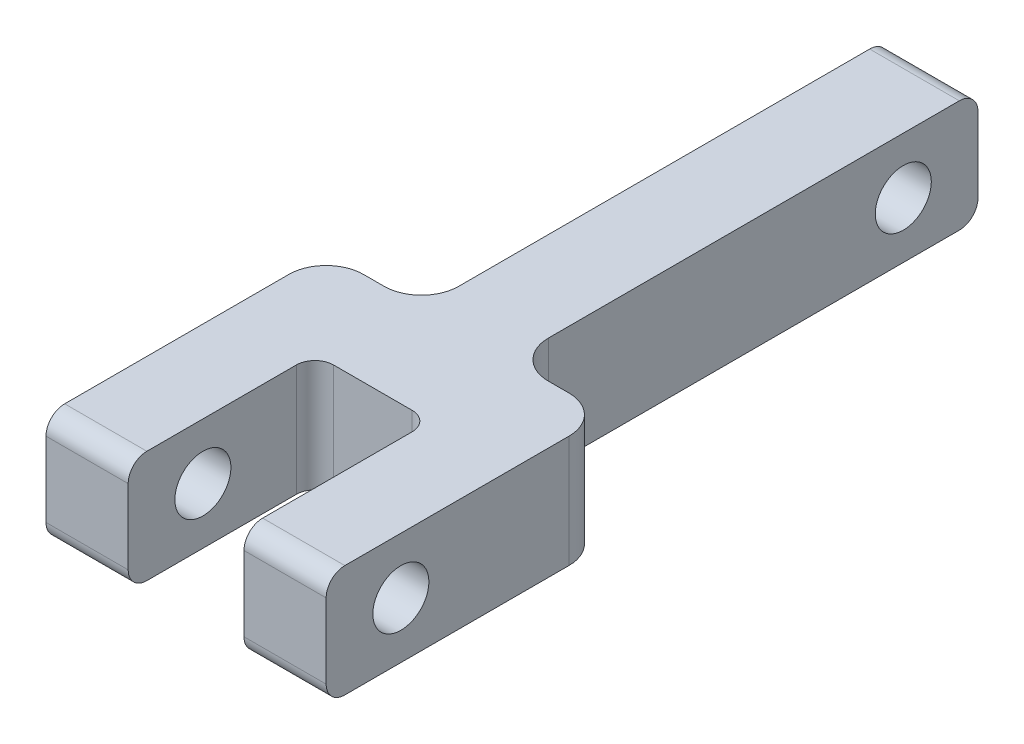
ISO-10303-21;
HEADER;
FILE_DESCRIPTION(('STEP AP214'),'2;1');
FILE_NAME('part.step','',(''),(''),'','','');
FILE_SCHEMA(('AUTOMOTIVE_DESIGN { 1 0 10303 214 1 1 1 1 }'));
ENDSEC;
DATA;
#1=APPLICATION_CONTEXT('core data for automotive mechanical design processes');
#2=APPLICATION_PROTOCOL_DEFINITION('international standard','automotive_design',2000,#1);
#3=PRODUCT_CONTEXT('',#1,'mechanical');
#4=PRODUCT('Part','Part','',(#3));
#5=PRODUCT_RELATED_PRODUCT_CATEGORY('part','',(#4));
#6=PRODUCT_DEFINITION_FORMATION('','',#4);
#7=PRODUCT_DEFINITION_CONTEXT('part definition',#1,'design');
#8=PRODUCT_DEFINITION('design','',#6,#7);
#9=PRODUCT_DEFINITION_SHAPE('','',#8);
#10=(LENGTH_UNIT() NAMED_UNIT(*) SI_UNIT(.MILLI.,.METRE.));
#11=(NAMED_UNIT(*) PLANE_ANGLE_UNIT() SI_UNIT($,.RADIAN.));
#12=(NAMED_UNIT(*) SI_UNIT($,.STERADIAN.) SOLID_ANGLE_UNIT());
#13=UNCERTAINTY_MEASURE_WITH_UNIT(LENGTH_MEASURE(1.E-05),#10,'distance_accuracy_value','');
#14=(GEOMETRIC_REPRESENTATION_CONTEXT(3) GLOBAL_UNCERTAINTY_ASSIGNED_CONTEXT((#13)) GLOBAL_UNIT_ASSIGNED_CONTEXT((#10,
#11,#12)) REPRESENTATION_CONTEXT('',''));
#15=CARTESIAN_POINT('',(0.,0.,0.));
#16=DIRECTION('',(0.,0.,1.));
#17=DIRECTION('',(1.,0.,0.));
#18=AXIS2_PLACEMENT_3D('',#15,#16,#17);
#19=CARTESIAN_POINT('',(2.4,-2.,19.));
#20=DIRECTION('',(-1.,0.,0.));
#21=DIRECTION('',(0.,0.,1.));
#22=AXIS2_PLACEMENT_3D('',#19,#20,#21);
#23=CYLINDRICAL_SURFACE('',#22,1.);
#24=CARTESIAN_POINT('',(-3.1,-2.,19.));
#25=DIRECTION('',(1.,0.,0.));
#26=DIRECTION('',(0.,0.,-1.));
#27=AXIS2_PLACEMENT_3D('',#24,#25,#26);
#28=CIRCLE('',#27,1.);
#29=CARTESIAN_POINT('',(-3.1,-2.,20.));
#30=VERTEX_POINT('',#29);
#31=CARTESIAN_POINT('',(-3.1,-3.,19.));
#32=VERTEX_POINT('',#31);
#33=EDGE_CURVE('E214',#30,#32,#28,.T.);
#34=ORIENTED_EDGE('',*,*,#33,.F.);
#35=DIRECTION('',(-1.,0.,0.));
#36=VECTOR('',#35,1.);
#37=CARTESIAN_POINT('',(2.4,-2.,20.));
#38=LINE('',#37,#36);
#39=CARTESIAN_POINT('',(-7.5,-2.,20.));
#40=VERTEX_POINT('',#39);
#41=EDGE_CURVE('E213',#30,#40,#38,.T.);
#42=ORIENTED_EDGE('',*,*,#41,.T.);
#43=CARTESIAN_POINT('',(-7.5,-2.,19.));
#44=DIRECTION('',(1.,0.,0.));
#45=DIRECTION('',(0.,0.,-1.));
#46=AXIS2_PLACEMENT_3D('',#43,#44,#45);
#47=CIRCLE('',#46,1.);
#48=CARTESIAN_POINT('',(-7.5,-3.,19.));
#49=VERTEX_POINT('',#48);
#50=EDGE_CURVE('E359',#40,#49,#47,.T.);
#51=ORIENTED_EDGE('',*,*,#50,.T.);
#52=DIRECTION('',(-1.,0.,0.));
#53=VECTOR('',#52,1.);
#54=CARTESIAN_POINT('',(2.4,-3.,19.));
#55=LINE('',#54,#53);
#56=EDGE_CURVE('E244',#32,#49,#55,.T.);
#57=ORIENTED_EDGE('',*,*,#56,.F.);
#58=EDGE_LOOP('',(#34,#42,#51,#57));
#59=FACE_BOUND('',#58,.T.);
#60=ADVANCED_FACE('F33',(#59),#23,.T.);
#61=CARTESIAN_POINT('',(2.4,-3.,19.));
#62=DIRECTION('',(0.,1.,0.));
#63=DIRECTION('',(0.,0.,1.));
#64=AXIS2_PLACEMENT_3D('',#61,#62,#63);
#65=PLANE('',#64);
#66=DIRECTION('',(-1.,0.,0.));
#67=VECTOR('',#66,1.);
#68=CARTESIAN_POINT('',(7.5,-3.,5.));
#69=LINE('',#68,#67);
#70=CARTESIAN_POINT('',(5.5,-3.,5.));
#71=VERTEX_POINT('',#70);
#72=CARTESIAN_POINT('',(4.4,-3.,5.));
#73=VERTEX_POINT('',#72);
#74=EDGE_CURVE('E372',#71,#73,#69,.T.);
#75=ORIENTED_EDGE('',*,*,#74,.F.);
#76=CARTESIAN_POINT('',(5.5,-3.,7.));
#77=DIRECTION('',(0.,1.,0.));
#78=DIRECTION('',(0.,0.,1.));
#79=AXIS2_PLACEMENT_3D('',#76,#77,#78);
#80=CIRCLE('',#79,2.);
#81=CARTESIAN_POINT('',(7.5,-3.,7.));
#82=VERTEX_POINT('',#81);
#83=EDGE_CURVE('E269',#71,#82,#80,.F.);
#84=ORIENTED_EDGE('',*,*,#83,.T.);
#85=DIRECTION('',(0.,0.,-1.));
#86=VECTOR('',#85,1.);
#87=CARTESIAN_POINT('',(7.5,-3.,5.));
#88=LINE('',#87,#86);
#89=CARTESIAN_POINT('',(7.5,-3.,19.));
#90=VERTEX_POINT('',#89);
#91=EDGE_CURVE('E350',#90,#82,#88,.T.);
#92=ORIENTED_EDGE('',*,*,#91,.F.);
#93=CARTESIAN_POINT('',(3.1,-3.,19.));
#94=VERTEX_POINT('',#93);
#95=EDGE_CURVE('E245',#90,#94,#55,.T.);
#96=ORIENTED_EDGE('',*,*,#95,.T.);
#97=DIRECTION('',(0.,0.,-1.));
#98=VECTOR('',#97,1.);
#99=CARTESIAN_POINT('',(3.1,-3.,10.));
#100=LINE('',#99,#98);
#101=CARTESIAN_POINT('',(3.1,-3.,11.));
#102=VERTEX_POINT('',#101);
#103=EDGE_CURVE('E330',#94,#102,#100,.T.);
#104=ORIENTED_EDGE('',*,*,#103,.T.);
#105=CARTESIAN_POINT('',(2.1,-3.,11.));
#106=DIRECTION('',(0.,1.,0.));
#107=DIRECTION('',(0.,0.,1.));
#108=AXIS2_PLACEMENT_3D('',#105,#106,#107);
#109=CIRCLE('',#108,1.);
#110=CARTESIAN_POINT('',(2.1,-3.,10.));
#111=VERTEX_POINT('',#110);
#112=EDGE_CURVE('E303',#102,#111,#109,.T.);
#113=ORIENTED_EDGE('',*,*,#112,.T.);
#114=DIRECTION('',(1.,0.,0.));
#115=VECTOR('',#114,1.);
#116=CARTESIAN_POINT('',(-3.1,-3.,10.));
#117=LINE('',#116,#115);
#118=CARTESIAN_POINT('',(-2.1,-3.,10.));
#119=VERTEX_POINT('',#118);
#120=EDGE_CURVE('E313',#119,#111,#117,.T.);
#121=ORIENTED_EDGE('',*,*,#120,.F.);
#122=CARTESIAN_POINT('',(-2.1,-3.,11.));
#123=DIRECTION('',(0.,1.,0.));
#124=DIRECTION('',(0.,0.,1.));
#125=AXIS2_PLACEMENT_3D('',#122,#123,#124);
#126=CIRCLE('',#125,1.);
#127=CARTESIAN_POINT('',(-3.1,-3.,11.));
#128=VERTEX_POINT('',#127);
#129=EDGE_CURVE('E11',#119,#128,#126,.T.);
#130=ORIENTED_EDGE('',*,*,#129,.T.);
#131=DIRECTION('',(0.,0.,-1.));
#132=VECTOR('',#131,1.);
#133=CARTESIAN_POINT('',(-3.1,-3.,10.));
#134=LINE('',#133,#132);
#135=EDGE_CURVE('E315',#32,#128,#134,.T.);
#136=ORIENTED_EDGE('',*,*,#135,.F.);
#137=ORIENTED_EDGE('',*,*,#56,.T.);
#138=DIRECTION('',(0.,0.,-1.));
#139=VECTOR('',#138,1.);
#140=CARTESIAN_POINT('',(-7.5,-3.,5.));
#141=LINE('',#140,#139);
#142=CARTESIAN_POINT('',(-7.5,-3.,7.));
#143=VERTEX_POINT('',#142);
#144=EDGE_CURVE('E362',#49,#143,#141,.T.);
#145=ORIENTED_EDGE('',*,*,#144,.T.);
#146=CARTESIAN_POINT('',(-5.5,-3.,7.));
#147=DIRECTION('',(0.,1.,0.));
#148=DIRECTION('',(0.,0.,1.));
#149=AXIS2_PLACEMENT_3D('',#146,#147,#148);
#150=CIRCLE('',#149,2.);
#151=CARTESIAN_POINT('',(-5.5,-3.,5.));
#152=VERTEX_POINT('',#151);
#153=EDGE_CURVE('E267',#143,#152,#150,.F.);
#154=ORIENTED_EDGE('',*,*,#153,.T.);
#155=CARTESIAN_POINT('',(-4.4,-3.,5.));
#156=VERTEX_POINT('',#155);
#157=EDGE_CURVE('E369',#156,#152,#69,.T.);
#158=ORIENTED_EDGE('',*,*,#157,.F.);
#159=CARTESIAN_POINT('',(-4.4,-3.,3.));
#160=DIRECTION('',(0.,1.,0.));
#161=DIRECTION('',(0.,0.,1.));
#162=AXIS2_PLACEMENT_3D('',#159,#160,#161);
#163=CIRCLE('',#162,2.);
#164=CARTESIAN_POINT('',(-2.4,-3.,3.));
#165=VERTEX_POINT('',#164);
#166=EDGE_CURVE('E288',#156,#165,#163,.T.);
#167=ORIENTED_EDGE('',*,*,#166,.T.);
#168=DIRECTION('',(0.,0.,-1.));
#169=VECTOR('',#168,1.);
#170=CARTESIAN_POINT('',(-2.4,-3.,19.));
#171=LINE('',#170,#169);
#172=CARTESIAN_POINT('',(-2.4,-3.,-19.));
#173=VERTEX_POINT('',#172);
#174=EDGE_CURVE('E379',#165,#173,#171,.T.);
#175=ORIENTED_EDGE('',*,*,#174,.T.);
#176=DIRECTION('',(-1.,0.,0.));
#177=VECTOR('',#176,1.);
#178=CARTESIAN_POINT('',(2.4,-3.,-19.));
#179=LINE('',#178,#177);
#180=CARTESIAN_POINT('',(2.4,-3.,-19.));
#181=VERTEX_POINT('',#180);
#182=EDGE_CURVE('E241',#181,#173,#179,.T.);
#183=ORIENTED_EDGE('',*,*,#182,.F.);
#184=DIRECTION('',(0.,0.,-1.));
#185=VECTOR('',#184,1.);
#186=CARTESIAN_POINT('',(2.4,-3.,19.));
#187=LINE('',#186,#185);
#188=CARTESIAN_POINT('',(2.4,-3.,3.));
#189=VERTEX_POINT('',#188);
#190=EDGE_CURVE('E380',#189,#181,#187,.T.);
#191=ORIENTED_EDGE('',*,*,#190,.F.);
#192=CARTESIAN_POINT('',(4.4,-3.,3.));
#193=DIRECTION('',(0.,1.,0.));
#194=DIRECTION('',(0.,0.,1.));
#195=AXIS2_PLACEMENT_3D('',#192,#193,#194);
#196=CIRCLE('',#195,2.);
#197=EDGE_CURVE('E284',#189,#73,#196,.T.);
#198=ORIENTED_EDGE('',*,*,#197,.T.);
#199=EDGE_LOOP('',(#75,#84,#92,#96,#104,#113,#121,#130,#136,#137,#145,#154,#158,#167,#175,#183,
#191,#198));
#200=FACE_BOUND('',#199,.T.);
#201=ADVANCED_FACE('F415',(#200),#65,.F.);
#202=CARTESIAN_POINT('',(2.4,3.,19.));
#203=DIRECTION('',(0.,-1.,0.));
#204=DIRECTION('',(0.,0.,-1.));
#205=AXIS2_PLACEMENT_3D('',#202,#203,#204);
#206=PLANE('',#205);
#207=DIRECTION('',(0.,0.,1.));
#208=VECTOR('',#207,1.);
#209=CARTESIAN_POINT('',(7.5,3.,19.));
#210=LINE('',#209,#208);
#211=CARTESIAN_POINT('',(7.5,3.,7.));
#212=VERTEX_POINT('',#211);
#213=CARTESIAN_POINT('',(7.5,3.,19.));
#214=VERTEX_POINT('',#213);
#215=EDGE_CURVE('E353',#212,#214,#210,.T.);
#216=ORIENTED_EDGE('',*,*,#215,.F.);
#217=CARTESIAN_POINT('',(5.5,3.,7.));
#218=DIRECTION('',(0.,-1.,0.));
#219=DIRECTION('',(0.,0.,-1.));
#220=AXIS2_PLACEMENT_3D('',#217,#218,#219);
#221=CIRCLE('',#220,2.);
#222=CARTESIAN_POINT('',(5.5,3.,5.));
#223=VERTEX_POINT('',#222);
#224=EDGE_CURVE('E261',#212,#223,#221,.F.);
#225=ORIENTED_EDGE('',*,*,#224,.T.);
#226=DIRECTION('',(-1.,0.,0.));
#227=VECTOR('',#226,1.);
#228=CARTESIAN_POINT('',(7.5,3.,5.));
#229=LINE('',#228,#227);
#230=CARTESIAN_POINT('',(4.4,3.,5.));
#231=VERTEX_POINT('',#230);
#232=EDGE_CURVE('E368',#223,#231,#229,.T.);
#233=ORIENTED_EDGE('',*,*,#232,.T.);
#234=CARTESIAN_POINT('',(4.4,3.,3.));
#235=DIRECTION('',(0.,-1.,0.));
#236=DIRECTION('',(0.,0.,-1.));
#237=AXIS2_PLACEMENT_3D('',#234,#235,#236);
#238=CIRCLE('',#237,2.);
#239=CARTESIAN_POINT('',(2.4,3.,3.));
#240=VERTEX_POINT('',#239);
#241=EDGE_CURVE('E286',#231,#240,#238,.T.);
#242=ORIENTED_EDGE('',*,*,#241,.T.);
#243=DIRECTION('',(0.,0.,1.));
#244=VECTOR('',#243,1.);
#245=CARTESIAN_POINT('',(2.4,3.,19.));
#246=LINE('',#245,#244);
#247=CARTESIAN_POINT('',(2.4,3.,-19.));
#248=VERTEX_POINT('',#247);
#249=EDGE_CURVE('E389',#248,#240,#246,.T.);
#250=ORIENTED_EDGE('',*,*,#249,.F.);
#251=DIRECTION('',(-1.,0.,0.));
#252=VECTOR('',#251,1.);
#253=CARTESIAN_POINT('',(2.4,3.,-19.));
#254=LINE('',#253,#252);
#255=CARTESIAN_POINT('',(-2.4,3.,-19.));
#256=VERTEX_POINT('',#255);
#257=EDGE_CURVE('E232',#248,#256,#254,.T.);
#258=ORIENTED_EDGE('',*,*,#257,.T.);
#259=DIRECTION('',(0.,0.,1.));
#260=VECTOR('',#259,1.);
#261=CARTESIAN_POINT('',(-2.4,3.,19.));
#262=LINE('',#261,#260);
#263=CARTESIAN_POINT('',(-2.4,3.,3.));
#264=VERTEX_POINT('',#263);
#265=EDGE_CURVE('E383',#256,#264,#262,.T.);
#266=ORIENTED_EDGE('',*,*,#265,.T.);
#267=CARTESIAN_POINT('',(-4.4,3.,3.));
#268=DIRECTION('',(0.,-1.,0.));
#269=DIRECTION('',(0.,0.,-1.));
#270=AXIS2_PLACEMENT_3D('',#267,#268,#269);
#271=CIRCLE('',#270,2.);
#272=CARTESIAN_POINT('',(-4.4,3.,5.));
#273=VERTEX_POINT('',#272);
#274=EDGE_CURVE('E290',#264,#273,#271,.T.);
#275=ORIENTED_EDGE('',*,*,#274,.T.);
#276=CARTESIAN_POINT('',(-5.5,3.,5.));
#277=VERTEX_POINT('',#276);
#278=EDGE_CURVE('E355',#273,#277,#229,.T.);
#279=ORIENTED_EDGE('',*,*,#278,.T.);
#280=CARTESIAN_POINT('',(-5.5,3.,7.));
#281=DIRECTION('',(0.,-1.,0.));
#282=DIRECTION('',(0.,0.,-1.));
#283=AXIS2_PLACEMENT_3D('',#280,#281,#282);
#284=CIRCLE('',#283,2.);
#285=CARTESIAN_POINT('',(-7.5,3.,7.));
#286=VERTEX_POINT('',#285);
#287=EDGE_CURVE('E259',#277,#286,#284,.F.);
#288=ORIENTED_EDGE('',*,*,#287,.T.);
#289=DIRECTION('',(0.,0.,1.));
#290=VECTOR('',#289,1.);
#291=CARTESIAN_POINT('',(-7.5,3.,19.));
#292=LINE('',#291,#290);
#293=CARTESIAN_POINT('',(-7.5,3.,19.));
#294=VERTEX_POINT('',#293);
#295=EDGE_CURVE('E344',#286,#294,#292,.T.);
#296=ORIENTED_EDGE('',*,*,#295,.T.);
#297=DIRECTION('',(-1.,0.,0.));
#298=VECTOR('',#297,1.);
#299=CARTESIAN_POINT('',(2.4,3.,19.));
#300=LINE('',#299,#298);
#301=CARTESIAN_POINT('',(-3.1,3.,19.));
#302=VERTEX_POINT('',#301);
#303=EDGE_CURVE('E224',#302,#294,#300,.T.);
#304=ORIENTED_EDGE('',*,*,#303,.F.);
#305=DIRECTION('',(0.,0.,1.));
#306=VECTOR('',#305,1.);
#307=CARTESIAN_POINT('',(-3.1,3.,19.));
#308=LINE('',#307,#306);
#309=CARTESIAN_POINT('',(-3.1,3.,11.));
#310=VERTEX_POINT('',#309);
#311=EDGE_CURVE('E200',#310,#302,#308,.T.);
#312=ORIENTED_EDGE('',*,*,#311,.F.);
#313=CARTESIAN_POINT('',(-2.1,3.,11.));
#314=DIRECTION('',(0.,-1.,0.));
#315=DIRECTION('',(0.,0.,-1.));
#316=AXIS2_PLACEMENT_3D('',#313,#314,#315);
#317=CIRCLE('',#316,1.);
#318=CARTESIAN_POINT('',(-2.1,3.,10.));
#319=VERTEX_POINT('',#318);
#320=EDGE_CURVE('E41',#310,#319,#317,.T.);
#321=ORIENTED_EDGE('',*,*,#320,.T.);
#322=DIRECTION('',(1.,0.,0.));
#323=VECTOR('',#322,1.);
#324=CARTESIAN_POINT('',(-3.1,3.,10.));
#325=LINE('',#324,#323);
#326=CARTESIAN_POINT('',(2.1,3.,10.));
#327=VERTEX_POINT('',#326);
#328=EDGE_CURVE('E253',#319,#327,#325,.T.);
#329=ORIENTED_EDGE('',*,*,#328,.T.);
#330=CARTESIAN_POINT('',(2.1,3.,11.));
#331=DIRECTION('',(0.,-1.,0.));
#332=DIRECTION('',(0.,0.,-1.));
#333=AXIS2_PLACEMENT_3D('',#330,#331,#332);
#334=CIRCLE('',#333,1.);
#335=CARTESIAN_POINT('',(3.1,3.,11.));
#336=VERTEX_POINT('',#335);
#337=EDGE_CURVE('E301',#327,#336,#334,.T.);
#338=ORIENTED_EDGE('',*,*,#337,.T.);
#339=DIRECTION('',(0.,0.,1.));
#340=VECTOR('',#339,1.);
#341=CARTESIAN_POINT('',(3.1,3.,19.));
#342=LINE('',#341,#340);
#343=CARTESIAN_POINT('',(3.1,3.,19.));
#344=VERTEX_POINT('',#343);
#345=EDGE_CURVE('E205',#336,#344,#342,.T.);
#346=ORIENTED_EDGE('',*,*,#345,.T.);
#347=EDGE_CURVE('E229',#214,#344,#300,.T.);
#348=ORIENTED_EDGE('',*,*,#347,.F.);
#349=EDGE_LOOP('',(#216,#225,#233,#242,#250,#258,#266,#275,#279,#288,#296,#304,#312,#321,#329,
#338,#346,#348));
#350=FACE_BOUND('',#349,.T.);
#351=ADVANCED_FACE('F308',(#350),#206,.F.);
#352=CARTESIAN_POINT('',(2.4,2.,19.));
#353=DIRECTION('',(-1.,0.,0.));
#354=DIRECTION('',(0.,0.,1.));
#355=AXIS2_PLACEMENT_3D('',#352,#353,#354);
#356=CYLINDRICAL_SURFACE('',#355,1.);
#357=CARTESIAN_POINT('',(-3.1,2.,19.));
#358=DIRECTION('',(1.,0.,0.));
#359=DIRECTION('',(0.,0.,-1.));
#360=AXIS2_PLACEMENT_3D('',#357,#358,#359);
#361=CIRCLE('',#360,1.);
#362=CARTESIAN_POINT('',(-3.1,2.,20.));
#363=VERTEX_POINT('',#362);
#364=EDGE_CURVE('E193',#302,#363,#361,.T.);
#365=ORIENTED_EDGE('',*,*,#364,.F.);
#366=ORIENTED_EDGE('',*,*,#303,.T.);
#367=CARTESIAN_POINT('',(-7.5,2.,19.));
#368=DIRECTION('',(1.,0.,0.));
#369=DIRECTION('',(0.,0.,-1.));
#370=AXIS2_PLACEMENT_3D('',#367,#368,#369);
#371=CIRCLE('',#370,1.);
#372=CARTESIAN_POINT('',(-7.5,2.,20.));
#373=VERTEX_POINT('',#372);
#374=EDGE_CURVE('E219',#294,#373,#371,.T.);
#375=ORIENTED_EDGE('',*,*,#374,.T.);
#376=DIRECTION('',(-1.,0.,0.));
#377=VECTOR('',#376,1.);
#378=CARTESIAN_POINT('',(2.4,2.,20.));
#379=LINE('',#378,#377);
#380=EDGE_CURVE('E211',#363,#373,#379,.T.);
#381=ORIENTED_EDGE('',*,*,#380,.F.);
#382=EDGE_LOOP('',(#365,#366,#375,#381));
#383=FACE_BOUND('',#382,.T.);
#384=ADVANCED_FACE('F217',(#383),#356,.T.);
#385=CARTESIAN_POINT('',(2.4,2.,20.));
#386=DIRECTION('',(0.,0.,-1.));
#387=DIRECTION('',(-1.,0.,0.));
#388=AXIS2_PLACEMENT_3D('',#385,#386,#387);
#389=PLANE('',#388);
#390=DIRECTION('',(0.,-1.,0.));
#391=VECTOR('',#390,1.);
#392=CARTESIAN_POINT('',(-3.1,2.,20.));
#393=LINE('',#392,#391);
#394=EDGE_CURVE('E197',#363,#30,#393,.T.);
#395=ORIENTED_EDGE('',*,*,#394,.F.);
#396=ORIENTED_EDGE('',*,*,#380,.T.);
#397=DIRECTION('',(0.,-1.,0.));
#398=VECTOR('',#397,1.);
#399=CARTESIAN_POINT('',(-7.5,2.,20.));
#400=LINE('',#399,#398);
#401=EDGE_CURVE('E357',#373,#40,#400,.T.);
#402=ORIENTED_EDGE('',*,*,#401,.T.);
#403=ORIENTED_EDGE('',*,*,#41,.F.);
#404=EDGE_LOOP('',(#395,#396,#402,#403));
#405=FACE_BOUND('',#404,.T.);
#406=ADVANCED_FACE('F209',(#405),#389,.F.);
#407=CARTESIAN_POINT('',(-2.4,0.,16.));
#408=DIRECTION('',(1.,0.,0.));
#409=DIRECTION('',(0.,0.,-1.));
#410=AXIS2_PLACEMENT_3D('',#407,#408,#409);
#411=CYLINDRICAL_SURFACE('',#410,1.5);
#412=CARTESIAN_POINT('',(-7.5,0.,16.));
#413=DIRECTION('',(1.,0.,0.));
#414=DIRECTION('',(0.,0.,-1.));
#415=AXIS2_PLACEMENT_3D('',#412,#413,#414);
#416=CIRCLE('',#415,1.5);
#417=CARTESIAN_POINT('',(-7.5,0.,14.5));
#418=VERTEX_POINT('',#417);
#419=EDGE_CURVE('E256',#418,#418,#416,.T.);
#420=ORIENTED_EDGE('',*,*,#419,.F.);
#421=EDGE_LOOP('',(#420));
#422=FACE_BOUND('',#421,.T.);
#423=CARTESIAN_POINT('',(-3.1,0.,16.));
#424=DIRECTION('',(1.,0.,0.));
#425=DIRECTION('',(0.,0.,-1.));
#426=AXIS2_PLACEMENT_3D('',#423,#424,#425);
#427=CIRCLE('',#426,1.5);
#428=CARTESIAN_POINT('',(-3.1,0.,14.5));
#429=VERTEX_POINT('',#428);
#430=EDGE_CURVE('E252',#429,#429,#427,.F.);
#431=ORIENTED_EDGE('',*,*,#430,.F.);
#432=EDGE_LOOP('',(#431));
#433=FACE_BOUND('',#432,.T.);
#434=ADVANCED_FACE('F515',(#422,#433),#411,.F.);
#435=CARTESIAN_POINT('',(2.4,-2.,19.));
#436=DIRECTION('',(1.,0.,0.));
#437=DIRECTION('',(0.,0.,-1.));
#438=AXIS2_PLACEMENT_3D('',#435,#436,#437);
#439=PLANE('',#438);
#440=CARTESIAN_POINT('',(2.4,0.,-16.));
#441=DIRECTION('',(1.,0.,0.));
#442=DIRECTION('',(0.,0.,-1.));
#443=AXIS2_PLACEMENT_3D('',#440,#441,#442);
#444=CIRCLE('',#443,1.50000000000001);
#445=CARTESIAN_POINT('',(2.4,0.,-17.5));
#446=VERTEX_POINT('',#445);
#447=EDGE_CURVE('E373',#446,#446,#444,.T.);
#448=ORIENTED_EDGE('',*,*,#447,.F.);
#449=EDGE_LOOP('',(#448));
#450=FACE_BOUND('',#449,.T.);
#451=ORIENTED_EDGE('',*,*,#249,.T.);
#452=DIRECTION('',(0.,-1.,0.));
#453=VECTOR('',#452,1.);
#454=CARTESIAN_POINT('',(2.4,-2.,3.));
#455=LINE('',#454,#453);
#456=EDGE_CURVE('E279',#240,#189,#455,.T.);
#457=ORIENTED_EDGE('',*,*,#456,.T.);
#458=ORIENTED_EDGE('',*,*,#190,.T.);
#459=CARTESIAN_POINT('',(2.4,-2.,-19.));
#460=DIRECTION('',(1.,0.,0.));
#461=DIRECTION('',(0.,0.,-1.));
#462=AXIS2_PLACEMENT_3D('',#459,#460,#461);
#463=CIRCLE('',#462,1.);
#464=CARTESIAN_POINT('',(2.4,-2.,-20.));
#465=VERTEX_POINT('',#464);
#466=EDGE_CURVE('E382',#181,#465,#463,.T.);
#467=ORIENTED_EDGE('',*,*,#466,.T.);
#468=DIRECTION('',(0.,1.,0.));
#469=VECTOR('',#468,1.);
#470=CARTESIAN_POINT('',(2.4,2.,-20.));
#471=LINE('',#470,#469);
#472=CARTESIAN_POINT('',(2.4,2.,-20.));
#473=VERTEX_POINT('',#472);
#474=EDGE_CURVE('E385',#465,#473,#471,.T.);
#475=ORIENTED_EDGE('',*,*,#474,.T.);
#476=CARTESIAN_POINT('',(2.4,2.,-19.));
#477=DIRECTION('',(1.,0.,0.));
#478=DIRECTION('',(0.,0.,1.));
#479=AXIS2_PLACEMENT_3D('',#476,#477,#478);
#480=CIRCLE('',#479,1.);
#481=EDGE_CURVE('E387',#473,#248,#480,.T.);
#482=ORIENTED_EDGE('',*,*,#481,.T.);
#483=EDGE_LOOP('',(#451,#457,#458,#467,#475,#482));
#484=FACE_BOUND('',#483,.T.);
#485=ADVANCED_FACE('F447',(#450,#484),#439,.T.);
#486=CARTESIAN_POINT('',(-2.4,-2.,19.));
#487=DIRECTION('',(1.,0.,0.));
#488=DIRECTION('',(0.,0.,-1.));
#489=AXIS2_PLACEMENT_3D('',#486,#487,#488);
#490=PLANE('',#489);
#491=CARTESIAN_POINT('',(-2.4,0.,-16.));
#492=DIRECTION('',(1.,0.,0.));
#493=DIRECTION('',(0.,0.,-1.));
#494=AXIS2_PLACEMENT_3D('',#491,#492,#493);
#495=CIRCLE('',#494,1.50000000000001);
#496=CARTESIAN_POINT('',(-2.4,0.,-17.5));
#497=VERTEX_POINT('',#496);
#498=EDGE_CURVE('E376',#497,#497,#495,.T.);
#499=ORIENTED_EDGE('',*,*,#498,.T.);
#500=EDGE_LOOP('',(#499));
#501=FACE_BOUND('',#500,.T.);
#502=ORIENTED_EDGE('',*,*,#174,.F.);
#503=DIRECTION('',(0.,-1.,0.));
#504=VECTOR('',#503,1.);
#505=CARTESIAN_POINT('',(-2.4,3.,3.));
#506=LINE('',#505,#504);
#507=EDGE_CURVE('E282',#165,#264,#506,.F.);
#508=ORIENTED_EDGE('',*,*,#507,.T.);
#509=ORIENTED_EDGE('',*,*,#265,.F.);
#510=CARTESIAN_POINT('',(-2.4,2.,-19.));
#511=DIRECTION('',(1.,0.,0.));
#512=DIRECTION('',(0.,0.,1.));
#513=AXIS2_PLACEMENT_3D('',#510,#511,#512);
#514=CIRCLE('',#513,1.);
#515=CARTESIAN_POINT('',(-2.4,2.,-20.));
#516=VERTEX_POINT('',#515);
#517=EDGE_CURVE('E397',#516,#256,#514,.T.);
#518=ORIENTED_EDGE('',*,*,#517,.F.);
#519=DIRECTION('',(0.,1.,0.));
#520=VECTOR('',#519,1.);
#521=CARTESIAN_POINT('',(-2.4,2.,-20.));
#522=LINE('',#521,#520);
#523=CARTESIAN_POINT('',(-2.4,-2.,-20.));
#524=VERTEX_POINT('',#523);
#525=EDGE_CURVE('E395',#524,#516,#522,.T.);
#526=ORIENTED_EDGE('',*,*,#525,.F.);
#527=CARTESIAN_POINT('',(-2.4,-2.,-19.));
#528=DIRECTION('',(1.,0.,0.));
#529=DIRECTION('',(0.,0.,-1.));
#530=AXIS2_PLACEMENT_3D('',#527,#528,#529);
#531=CIRCLE('',#530,1.);
#532=EDGE_CURVE('E393',#173,#524,#531,.T.);
#533=ORIENTED_EDGE('',*,*,#532,.F.);
#534=EDGE_LOOP('',(#502,#508,#509,#518,#526,#533));
#535=FACE_BOUND('',#534,.T.);
#536=ADVANCED_FACE('F438',(#501,#535),#490,.F.);
#537=CARTESIAN_POINT('',(7.5,-2.,20.));
#538=VERTEX_POINT('',#537);
#539=CARTESIAN_POINT('',(3.1,-2.,20.));
#540=VERTEX_POINT('',#539);
#541=EDGE_CURVE('E221',#538,#540,#38,.T.);
#542=ORIENTED_EDGE('',*,*,#541,.T.);
#543=CARTESIAN_POINT('',(3.1,-2.,19.));
#544=DIRECTION('',(1.,0.,0.));
#545=DIRECTION('',(0.,0.,-1.));
#546=AXIS2_PLACEMENT_3D('',#543,#544,#545);
#547=CIRCLE('',#546,1.);
#548=EDGE_CURVE('E327',#540,#94,#547,.T.);
#549=ORIENTED_EDGE('',*,*,#548,.T.);
#550=ORIENTED_EDGE('',*,*,#95,.F.);
#551=CARTESIAN_POINT('',(7.5,-2.,19.));
#552=DIRECTION('',(1.,0.,0.));
#553=DIRECTION('',(0.,0.,-1.));
#554=AXIS2_PLACEMENT_3D('',#551,#552,#553);
#555=CIRCLE('',#554,1.);
#556=EDGE_CURVE('E347',#538,#90,#555,.T.);
#557=ORIENTED_EDGE('',*,*,#556,.F.);
#558=EDGE_LOOP('',(#542,#549,#550,#557));
#559=FACE_BOUND('',#558,.T.);
#560=ADVANCED_FACE('F430',(#559),#23,.T.);
#561=CARTESIAN_POINT('',(2.4,-2.,-19.));
#562=DIRECTION('',(-1.,0.,0.));
#563=DIRECTION('',(0.,0.,1.));
#564=AXIS2_PLACEMENT_3D('',#561,#562,#563);
#565=CYLINDRICAL_SURFACE('',#564,1.);
#566=ORIENTED_EDGE('',*,*,#532,.T.);
#567=DIRECTION('',(-1.,0.,0.));
#568=VECTOR('',#567,1.);
#569=CARTESIAN_POINT('',(2.4,-2.,-20.));
#570=LINE('',#569,#568);
#571=EDGE_CURVE('E238',#465,#524,#570,.T.);
#572=ORIENTED_EDGE('',*,*,#571,.F.);
#573=ORIENTED_EDGE('',*,*,#466,.F.);
#574=ORIENTED_EDGE('',*,*,#182,.T.);
#575=EDGE_LOOP('',(#566,#572,#573,#574));
#576=FACE_BOUND('',#575,.T.);
#577=ADVANCED_FACE('F437',(#576),#565,.T.);
#578=CARTESIAN_POINT('',(2.4,2.,-20.));
#579=DIRECTION('',(0.,0.,1.));
#580=DIRECTION('',(1.,0.,0.));
#581=AXIS2_PLACEMENT_3D('',#578,#579,#580);
#582=PLANE('',#581);
#583=ORIENTED_EDGE('',*,*,#525,.T.);
#584=DIRECTION('',(-1.,0.,0.));
#585=VECTOR('',#584,1.);
#586=CARTESIAN_POINT('',(2.4,2.,-20.));
#587=LINE('',#586,#585);
#588=EDGE_CURVE('E235',#473,#516,#587,.T.);
#589=ORIENTED_EDGE('',*,*,#588,.F.);
#590=ORIENTED_EDGE('',*,*,#474,.F.);
#591=ORIENTED_EDGE('',*,*,#571,.T.);
#592=EDGE_LOOP('',(#583,#589,#590,#591));
#593=FACE_BOUND('',#592,.T.);
#594=ADVANCED_FACE('F444',(#593),#582,.F.);
#595=CARTESIAN_POINT('',(2.4,2.,-19.));
#596=DIRECTION('',(-1.,0.,0.));
#597=DIRECTION('',(0.,0.,1.));
#598=AXIS2_PLACEMENT_3D('',#595,#596,#597);
#599=CYLINDRICAL_SURFACE('',#598,1.);
#600=ORIENTED_EDGE('',*,*,#517,.T.);
#601=ORIENTED_EDGE('',*,*,#257,.F.);
#602=ORIENTED_EDGE('',*,*,#481,.F.);
#603=ORIENTED_EDGE('',*,*,#588,.T.);
#604=EDGE_LOOP('',(#600,#601,#602,#603));
#605=FACE_BOUND('',#604,.T.);
#606=ADVANCED_FACE('F492',(#605),#599,.T.);
#607=ORIENTED_EDGE('',*,*,#347,.T.);
#608=CARTESIAN_POINT('',(3.1,2.,19.));
#609=DIRECTION('',(1.,0.,0.));
#610=DIRECTION('',(0.,0.,-1.));
#611=AXIS2_PLACEMENT_3D('',#608,#609,#610);
#612=CIRCLE('',#611,1.);
#613=CARTESIAN_POINT('',(3.1,2.,20.));
#614=VERTEX_POINT('',#613);
#615=EDGE_CURVE('E321',#344,#614,#612,.T.);
#616=ORIENTED_EDGE('',*,*,#615,.T.);
#617=CARTESIAN_POINT('',(7.5,2.,20.));
#618=VERTEX_POINT('',#617);
#619=EDGE_CURVE('E220',#618,#614,#379,.T.);
#620=ORIENTED_EDGE('',*,*,#619,.F.);
#621=CARTESIAN_POINT('',(7.5,2.,19.));
#622=DIRECTION('',(1.,0.,0.));
#623=DIRECTION('',(0.,0.,-1.));
#624=AXIS2_PLACEMENT_3D('',#621,#622,#623);
#625=CIRCLE('',#624,1.);
#626=EDGE_CURVE('E340',#214,#618,#625,.T.);
#627=ORIENTED_EDGE('',*,*,#626,.F.);
#628=EDGE_LOOP('',(#607,#616,#620,#627));
#629=FACE_BOUND('',#628,.T.);
#630=ADVANCED_FACE('F461',(#629),#356,.T.);
#631=ORIENTED_EDGE('',*,*,#619,.T.);
#632=DIRECTION('',(0.,-1.,0.));
#633=VECTOR('',#632,1.);
#634=CARTESIAN_POINT('',(3.1,2.,20.));
#635=LINE('',#634,#633);
#636=EDGE_CURVE('E324',#614,#540,#635,.T.);
#637=ORIENTED_EDGE('',*,*,#636,.T.);
#638=ORIENTED_EDGE('',*,*,#541,.F.);
#639=DIRECTION('',(0.,-1.,0.));
#640=VECTOR('',#639,1.);
#641=CARTESIAN_POINT('',(7.5,2.,20.));
#642=LINE('',#641,#640);
#643=EDGE_CURVE('E343',#618,#538,#642,.T.);
#644=ORIENTED_EDGE('',*,*,#643,.F.);
#645=EDGE_LOOP('',(#631,#637,#638,#644));
#646=FACE_BOUND('',#645,.T.);
#647=ADVANCED_FACE('F453',(#646),#389,.F.);
#648=CARTESIAN_POINT('',(-2.4,0.,-16.));
#649=DIRECTION('',(1.,0.,0.));
#650=DIRECTION('',(0.,0.,-1.));
#651=AXIS2_PLACEMENT_3D('',#648,#649,#650);
#652=CYLINDRICAL_SURFACE('',#651,1.50000000000001);
#653=ORIENTED_EDGE('',*,*,#498,.F.);
#654=EDGE_LOOP('',(#653));
#655=FACE_BOUND('',#654,.T.);
#656=ORIENTED_EDGE('',*,*,#447,.T.);
#657=EDGE_LOOP('',(#656));
#658=FACE_BOUND('',#657,.T.);
#659=ADVANCED_FACE('F511',(#655,#658),#652,.F.);
#660=CARTESIAN_POINT('',(7.5,3.,5.));
#661=DIRECTION('',(0.,0.,1.));
#662=DIRECTION('',(1.,0.,0.));
#663=AXIS2_PLACEMENT_3D('',#660,#661,#662);
#664=PLANE('',#663);
#665=ORIENTED_EDGE('',*,*,#157,.T.);
#666=DIRECTION('',(0.,1.,0.));
#667=VECTOR('',#666,1.);
#668=CARTESIAN_POINT('',(-5.5,3.,5.));
#669=LINE('',#668,#667);
#670=EDGE_CURVE('E274',#152,#277,#669,.T.);
#671=ORIENTED_EDGE('',*,*,#670,.T.);
#672=ORIENTED_EDGE('',*,*,#278,.F.);
#673=DIRECTION('',(0.,-1.,0.));
#674=VECTOR('',#673,1.);
#675=CARTESIAN_POINT('',(-4.4,-3.,5.));
#676=LINE('',#675,#674);
#677=EDGE_CURVE('E271',#273,#156,#676,.T.);
#678=ORIENTED_EDGE('',*,*,#677,.T.);
#679=EDGE_LOOP('',(#665,#671,#672,#678));
#680=FACE_BOUND('',#679,.T.);
#681=ADVANCED_FACE('F412',(#680),#664,.F.);
#682=CARTESIAN_POINT('',(-7.5,2.,19.));
#683=DIRECTION('',(1.,0.,0.));
#684=DIRECTION('',(0.,0.,-1.));
#685=AXIS2_PLACEMENT_3D('',#682,#683,#684);
#686=PLANE('',#685);
#687=ORIENTED_EDGE('',*,*,#295,.F.);
#688=DIRECTION('',(0.,1.,0.));
#689=VECTOR('',#688,1.);
#690=CARTESIAN_POINT('',(-7.5,2.,7.));
#691=LINE('',#690,#689);
#692=EDGE_CURVE('E277',#286,#143,#691,.F.);
#693=ORIENTED_EDGE('',*,*,#692,.T.);
#694=ORIENTED_EDGE('',*,*,#144,.F.);
#695=ORIENTED_EDGE('',*,*,#50,.F.);
#696=ORIENTED_EDGE('',*,*,#401,.F.);
#697=ORIENTED_EDGE('',*,*,#374,.F.);
#698=EDGE_LOOP('',(#687,#693,#694,#695,#696,#697));
#699=FACE_BOUND('',#698,.T.);
#700=ORIENTED_EDGE('',*,*,#419,.T.);
#701=EDGE_LOOP('',(#700));
#702=FACE_BOUND('',#701,.T.);
#703=ADVANCED_FACE('F424',(#699,#702),#686,.F.);
#704=CARTESIAN_POINT('',(3.1,0.,16.));
#705=DIRECTION('',(1.,0.,0.));
#706=DIRECTION('',(0.,0.,-1.));
#707=AXIS2_PLACEMENT_3D('',#704,#705,#706);
#708=CIRCLE('',#707,1.5);
#709=CARTESIAN_POINT('',(3.1,0.,14.5));
#710=VERTEX_POINT('',#709);
#711=EDGE_CURVE('E249',#710,#710,#708,.F.);
#712=ORIENTED_EDGE('',*,*,#711,.T.);
#713=EDGE_LOOP('',(#712));
#714=FACE_BOUND('',#713,.T.);
#715=CARTESIAN_POINT('',(7.5,0.,16.));
#716=DIRECTION('',(1.,0.,0.));
#717=DIRECTION('',(0.,0.,-1.));
#718=AXIS2_PLACEMENT_3D('',#715,#716,#717);
#719=CIRCLE('',#718,1.5);
#720=CARTESIAN_POINT('',(7.5,0.,14.5));
#721=VERTEX_POINT('',#720);
#722=EDGE_CURVE('E335',#721,#721,#719,.T.);
#723=ORIENTED_EDGE('',*,*,#722,.T.);
#724=EDGE_LOOP('',(#723));
#725=FACE_BOUND('',#724,.T.);
#726=ADVANCED_FACE('F520',(#714,#725),#411,.F.);
#727=CARTESIAN_POINT('',(7.5,2.,19.));
#728=DIRECTION('',(1.,0.,0.));
#729=DIRECTION('',(0.,0.,-1.));
#730=AXIS2_PLACEMENT_3D('',#727,#728,#729);
#731=PLANE('',#730);
#732=ORIENTED_EDGE('',*,*,#91,.T.);
#733=DIRECTION('',(0.,1.,0.));
#734=VECTOR('',#733,1.);
#735=CARTESIAN_POINT('',(7.5,3.,7.));
#736=LINE('',#735,#734);
#737=EDGE_CURVE('E248',#82,#212,#736,.T.);
#738=ORIENTED_EDGE('',*,*,#737,.T.);
#739=ORIENTED_EDGE('',*,*,#215,.T.);
#740=ORIENTED_EDGE('',*,*,#626,.T.);
#741=ORIENTED_EDGE('',*,*,#643,.T.);
#742=ORIENTED_EDGE('',*,*,#556,.T.);
#743=EDGE_LOOP('',(#732,#738,#739,#740,#741,#742));
#744=FACE_BOUND('',#743,.T.);
#745=ORIENTED_EDGE('',*,*,#722,.F.);
#746=EDGE_LOOP('',(#745));
#747=FACE_BOUND('',#746,.T.);
#748=ADVANCED_FACE('F455',(#744,#747),#731,.T.);
#749=ORIENTED_EDGE('',*,*,#232,.F.);
#750=DIRECTION('',(0.,1.,0.));
#751=VECTOR('',#750,1.);
#752=CARTESIAN_POINT('',(5.5,-3.,5.));
#753=LINE('',#752,#751);
#754=EDGE_CURVE('E265',#223,#71,#753,.F.);
#755=ORIENTED_EDGE('',*,*,#754,.T.);
#756=ORIENTED_EDGE('',*,*,#74,.T.);
#757=DIRECTION('',(0.,-1.,0.));
#758=VECTOR('',#757,1.);
#759=CARTESIAN_POINT('',(4.4,3.,5.));
#760=LINE('',#759,#758);
#761=EDGE_CURVE('E263',#73,#231,#760,.F.);
#762=ORIENTED_EDGE('',*,*,#761,.T.);
#763=EDGE_LOOP('',(#749,#755,#756,#762));
#764=FACE_BOUND('',#763,.T.);
#765=ADVANCED_FACE('F478',(#764),#664,.F.);
#766=CARTESIAN_POINT('',(-3.1,2.,19.));
#767=DIRECTION('',(1.,0.,0.));
#768=DIRECTION('',(0.,0.,-1.));
#769=AXIS2_PLACEMENT_3D('',#766,#767,#768);
#770=PLANE('',#769);
#771=ORIENTED_EDGE('',*,*,#135,.T.);
#772=DIRECTION('',(0.,1.,0.));
#773=VECTOR('',#772,1.);
#774=CARTESIAN_POINT('',(-3.1,2.,11.));
#775=LINE('',#774,#773);
#776=EDGE_CURVE('E299',#128,#310,#775,.T.);
#777=ORIENTED_EDGE('',*,*,#776,.T.);
#778=ORIENTED_EDGE('',*,*,#311,.T.);
#779=ORIENTED_EDGE('',*,*,#364,.T.);
#780=ORIENTED_EDGE('',*,*,#394,.T.);
#781=ORIENTED_EDGE('',*,*,#33,.T.);
#782=EDGE_LOOP('',(#771,#777,#778,#779,#780,#781));
#783=FACE_BOUND('',#782,.T.);
#784=ORIENTED_EDGE('',*,*,#430,.T.);
#785=EDGE_LOOP('',(#784));
#786=FACE_BOUND('',#785,.T.);
#787=ADVANCED_FACE('F195',(#783,#786),#770,.T.);
#788=CARTESIAN_POINT('',(3.1,2.,19.));
#789=DIRECTION('',(1.,0.,0.));
#790=DIRECTION('',(0.,0.,-1.));
#791=AXIS2_PLACEMENT_3D('',#788,#789,#790);
#792=PLANE('',#791);
#793=ORIENTED_EDGE('',*,*,#345,.F.);
#794=DIRECTION('',(0.,1.,0.));
#795=VECTOR('',#794,1.);
#796=CARTESIAN_POINT('',(3.1,-3.,11.));
#797=LINE('',#796,#795);
#798=EDGE_CURVE('E297',#336,#102,#797,.F.);
#799=ORIENTED_EDGE('',*,*,#798,.T.);
#800=ORIENTED_EDGE('',*,*,#103,.F.);
#801=ORIENTED_EDGE('',*,*,#548,.F.);
#802=ORIENTED_EDGE('',*,*,#636,.F.);
#803=ORIENTED_EDGE('',*,*,#615,.F.);
#804=EDGE_LOOP('',(#793,#799,#800,#801,#802,#803));
#805=FACE_BOUND('',#804,.T.);
#806=ORIENTED_EDGE('',*,*,#711,.F.);
#807=EDGE_LOOP('',(#806));
#808=FACE_BOUND('',#807,.T.);
#809=ADVANCED_FACE('F465',(#805,#808),#792,.F.);
#810=CARTESIAN_POINT('',(-3.1,3.,10.));
#811=DIRECTION('',(0.,0.,-1.));
#812=DIRECTION('',(-1.,0.,0.));
#813=AXIS2_PLACEMENT_3D('',#810,#811,#812);
#814=PLANE('',#813);
#815=ORIENTED_EDGE('',*,*,#120,.T.);
#816=DIRECTION('',(0.,1.,0.));
#817=VECTOR('',#816,1.);
#818=CARTESIAN_POINT('',(2.1,3.,10.));
#819=LINE('',#818,#817);
#820=EDGE_CURVE('E294',#111,#327,#819,.T.);
#821=ORIENTED_EDGE('',*,*,#820,.T.);
#822=ORIENTED_EDGE('',*,*,#328,.F.);
#823=DIRECTION('',(0.,1.,0.));
#824=VECTOR('',#823,1.);
#825=CARTESIAN_POINT('',(-2.1,3.,10.));
#826=LINE('',#825,#824);
#827=EDGE_CURVE('E292',#319,#119,#826,.F.);
#828=ORIENTED_EDGE('',*,*,#827,.T.);
#829=EDGE_LOOP('',(#815,#821,#822,#828));
#830=FACE_BOUND('',#829,.T.);
#831=ADVANCED_FACE('F311',(#830),#814,.F.);
#832=CARTESIAN_POINT('',(5.5,2.,7.));
#833=DIRECTION('',(0.,-1.,0.));
#834=DIRECTION('',(0.,0.,-1.));
#835=AXIS2_PLACEMENT_3D('',#832,#833,#834);
#836=CYLINDRICAL_SURFACE('',#835,2.);
#837=ORIENTED_EDGE('',*,*,#83,.F.);
#838=ORIENTED_EDGE('',*,*,#754,.F.);
#839=ORIENTED_EDGE('',*,*,#224,.F.);
#840=ORIENTED_EDGE('',*,*,#737,.F.);
#841=EDGE_LOOP('',(#837,#838,#839,#840));
#842=FACE_BOUND('',#841,.T.);
#843=ADVANCED_FACE('F482',(#842),#836,.T.);
#844=CARTESIAN_POINT('',(-5.5,3.,7.));
#845=DIRECTION('',(0.,1.,0.));
#846=DIRECTION('',(0.,0.,1.));
#847=AXIS2_PLACEMENT_3D('',#844,#845,#846);
#848=CYLINDRICAL_SURFACE('',#847,2.);
#849=ORIENTED_EDGE('',*,*,#153,.F.);
#850=ORIENTED_EDGE('',*,*,#692,.F.);
#851=ORIENTED_EDGE('',*,*,#287,.F.);
#852=ORIENTED_EDGE('',*,*,#670,.F.);
#853=EDGE_LOOP('',(#849,#850,#851,#852));
#854=FACE_BOUND('',#853,.T.);
#855=ADVANCED_FACE('F421',(#854),#848,.T.);
#856=CARTESIAN_POINT('',(4.4,-2.,3.));
#857=DIRECTION('',(0.,-1.,0.));
#858=DIRECTION('',(0.,0.,-1.));
#859=AXIS2_PLACEMENT_3D('',#856,#857,#858);
#860=CYLINDRICAL_SURFACE('',#859,2.);
#861=ORIENTED_EDGE('',*,*,#241,.F.);
#862=ORIENTED_EDGE('',*,*,#761,.F.);
#863=ORIENTED_EDGE('',*,*,#197,.F.);
#864=ORIENTED_EDGE('',*,*,#456,.F.);
#865=EDGE_LOOP('',(#861,#862,#863,#864));
#866=FACE_BOUND('',#865,.T.);
#867=ADVANCED_FACE('F485',(#866),#860,.F.);
#868=CARTESIAN_POINT('',(-4.4,3.,3.));
#869=DIRECTION('',(0.,1.,0.));
#870=DIRECTION('',(0.,0.,1.));
#871=AXIS2_PLACEMENT_3D('',#868,#869,#870);
#872=CYLINDRICAL_SURFACE('',#871,2.);
#873=ORIENTED_EDGE('',*,*,#274,.F.);
#874=ORIENTED_EDGE('',*,*,#507,.F.);
#875=ORIENTED_EDGE('',*,*,#166,.F.);
#876=ORIENTED_EDGE('',*,*,#677,.F.);
#877=EDGE_LOOP('',(#873,#874,#875,#876));
#878=FACE_BOUND('',#877,.T.);
#879=ADVANCED_FACE('F409',(#878),#872,.F.);
#880=CARTESIAN_POINT('',(2.1,3.,11.));
#881=DIRECTION('',(0.,-1.,0.));
#882=DIRECTION('',(0.,0.,-1.));
#883=AXIS2_PLACEMENT_3D('',#880,#881,#882);
#884=CYLINDRICAL_SURFACE('',#883,1.);
#885=ORIENTED_EDGE('',*,*,#112,.F.);
#886=ORIENTED_EDGE('',*,*,#798,.F.);
#887=ORIENTED_EDGE('',*,*,#337,.F.);
#888=ORIENTED_EDGE('',*,*,#820,.F.);
#889=EDGE_LOOP('',(#885,#886,#887,#888));
#890=FACE_BOUND('',#889,.T.);
#891=ADVANCED_FACE('F470',(#890),#884,.F.);
#892=CARTESIAN_POINT('',(-2.1,2.,11.));
#893=DIRECTION('',(0.,1.,0.));
#894=DIRECTION('',(0.,0.,1.));
#895=AXIS2_PLACEMENT_3D('',#892,#893,#894);
#896=CYLINDRICAL_SURFACE('',#895,1.);
#897=ORIENTED_EDGE('',*,*,#129,.F.);
#898=ORIENTED_EDGE('',*,*,#827,.F.);
#899=ORIENTED_EDGE('',*,*,#320,.F.);
#900=ORIENTED_EDGE('',*,*,#776,.F.);
#901=EDGE_LOOP('',(#897,#898,#899,#900));
#902=FACE_BOUND('',#901,.T.);
#903=ADVANCED_FACE('F35',(#902),#896,.F.);
#904=CLOSED_SHELL('',(#60,#201,#351,#384,#406,#434,#485,#536,#560,#577,#594,#606,#630,#647,#659,
#681,#703,#726,#748,#765,#787,#809,#831,#843,#855,#867,#879,#891,#903));
#905=MANIFOLD_SOLID_BREP('B2',#904);
#906=ADVANCED_BREP_SHAPE_REPRESENTATION('',(#18,#905),#14);
#907=SHAPE_DEFINITION_REPRESENTATION(#9,#906);
ENDSEC;
END-ISO-10303-21;
